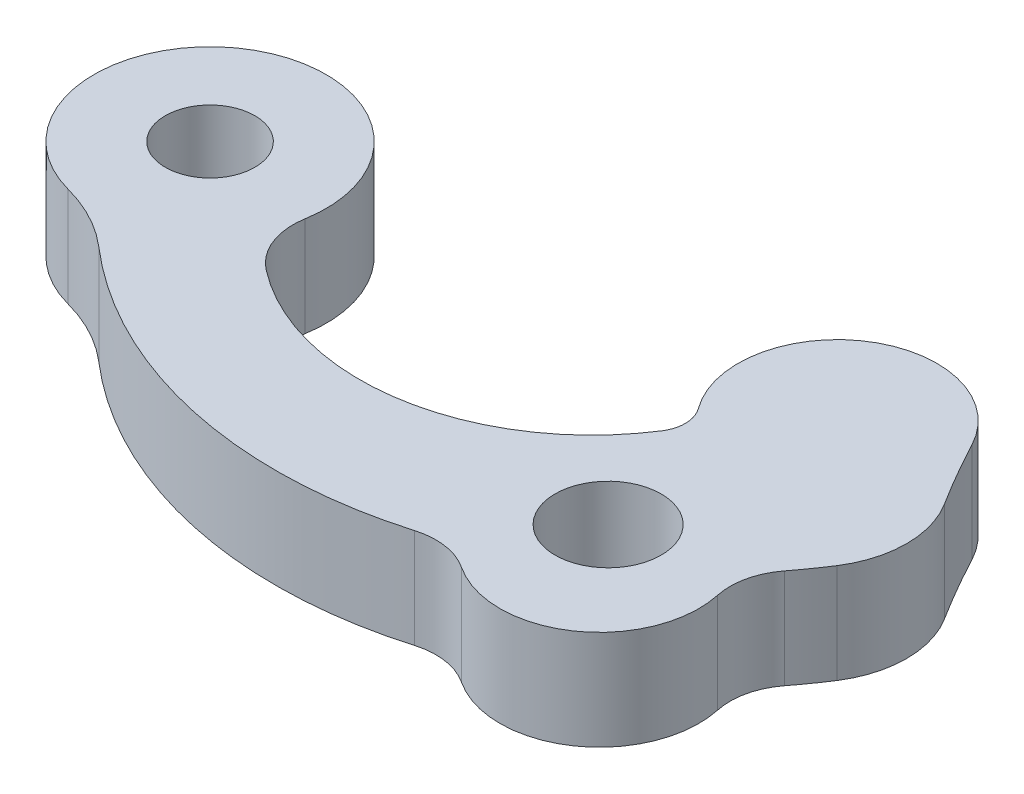
ISO-10303-21;
HEADER;
FILE_DESCRIPTION(('STEP AP214'),'2;1');
FILE_NAME('part.step','',(''),(''),'','','');
FILE_SCHEMA(('AUTOMOTIVE_DESIGN { 1 0 10303 214 1 1 1 1 }'));
ENDSEC;
DATA;
#1=APPLICATION_CONTEXT('core data for automotive mechanical design processes');
#2=APPLICATION_PROTOCOL_DEFINITION('international standard','automotive_design',2000,#1);
#3=PRODUCT_CONTEXT('',#1,'mechanical');
#4=PRODUCT('Part','Part','',(#3));
#5=PRODUCT_RELATED_PRODUCT_CATEGORY('part','',(#4));
#6=PRODUCT_DEFINITION_FORMATION('','',#4);
#7=PRODUCT_DEFINITION_CONTEXT('part definition',#1,'design');
#8=PRODUCT_DEFINITION('design','',#6,#7);
#9=PRODUCT_DEFINITION_SHAPE('','',#8);
#10=(LENGTH_UNIT() NAMED_UNIT(*) SI_UNIT(.MILLI.,.METRE.));
#11=(NAMED_UNIT(*) PLANE_ANGLE_UNIT() SI_UNIT($,.RADIAN.));
#12=(NAMED_UNIT(*) SI_UNIT($,.STERADIAN.) SOLID_ANGLE_UNIT());
#13=UNCERTAINTY_MEASURE_WITH_UNIT(LENGTH_MEASURE(1.E-05),#10,'distance_accuracy_value','');
#14=(GEOMETRIC_REPRESENTATION_CONTEXT(3) GLOBAL_UNCERTAINTY_ASSIGNED_CONTEXT((#13)) GLOBAL_UNIT_ASSIGNED_CONTEXT((#10,
#11,#12)) REPRESENTATION_CONTEXT('',''));
#15=CARTESIAN_POINT('',(0.,0.,0.));
#16=DIRECTION('',(0.,0.,1.));
#17=DIRECTION('',(1.,0.,0.));
#18=AXIS2_PLACEMENT_3D('',#15,#16,#17);
#19=CARTESIAN_POINT('',(9.58333333333333,3.,-5.39997427977414));
#20=DIRECTION('',(0.,-1.,0.));
#21=DIRECTION('',(0.,0.,1.));
#22=AXIS2_PLACEMENT_3D('',#19,#20,#21);
#23=CYLINDRICAL_SURFACE('',#22,13.);
#24=CARTESIAN_POINT('',(9.58333333333333,0.,-5.39997427977414));
#25=DIRECTION('',(0.,-1.,0.));
#26=DIRECTION('',(0.,0.,-1.));
#27=AXIS2_PLACEMENT_3D('',#24,#25,#26);
#28=CIRCLE('',#27,13.);
#29=CARTESIAN_POINT('',(19.8692193431616,0.,2.54990301442477));
#30=VERTEX_POINT('',#29);
#31=CARTESIAN_POINT('',(20.525,0.,1.61999228393224));
#32=VERTEX_POINT('',#31);
#33=EDGE_CURVE('E155',#30,#32,#28,.F.);
#34=ORIENTED_EDGE('',*,*,#33,.T.);
#35=DIRECTION('',(0.,-1.,0.));
#36=VECTOR('',#35,1.);
#37=CARTESIAN_POINT('',(20.525,3.,1.61999228393224));
#38=LINE('',#37,#36);
#39=CARTESIAN_POINT('',(20.525,3.,1.61999228393224));
#40=VERTEX_POINT('',#39);
#41=EDGE_CURVE('E140',#40,#32,#38,.T.);
#42=ORIENTED_EDGE('',*,*,#41,.F.);
#43=CARTESIAN_POINT('',(9.58333333333333,3.,-5.39997427977414));
#44=DIRECTION('',(0.,-1.,0.));
#45=DIRECTION('',(0.,0.,-1.));
#46=AXIS2_PLACEMENT_3D('',#43,#44,#45);
#47=CIRCLE('',#46,13.);
#48=CARTESIAN_POINT('',(19.8692193431616,3.,2.54990301442477));
#49=VERTEX_POINT('',#48);
#50=EDGE_CURVE('E144',#49,#40,#47,.F.);
#51=ORIENTED_EDGE('',*,*,#50,.F.);
#52=DIRECTION('',(0.,-1.,0.));
#53=VECTOR('',#52,1.);
#54=CARTESIAN_POINT('',(19.8692193431616,3.,2.54990301442477));
#55=LINE('',#54,#53);
#56=EDGE_CURVE('E206',#30,#49,#55,.F.);
#57=ORIENTED_EDGE('',*,*,#56,.F.);
#58=EDGE_LOOP('',(#34,#42,#51,#57));
#59=FACE_BOUND('',#58,.T.);
#60=ADVANCED_FACE('F41',(#59),#23,.T.);
#61=CARTESIAN_POINT('',(8.47222222222222,3.,-3.03668414842308));
#62=DIRECTION('',(0.,-1.,0.));
#63=DIRECTION('',(0.,0.,1.));
#64=AXIS2_PLACEMENT_3D('',#61,#62,#63);
#65=CYLINDRICAL_SURFACE('',#64,7.);
#66=CARTESIAN_POINT('',(8.47222222222222,0.,-3.03668414842308));
#67=DIRECTION('',(0.,-1.,0.));
#68=DIRECTION('',(0.,0.,-1.));
#69=AXIS2_PLACEMENT_3D('',#66,#67,#68);
#70=CIRCLE('',#69,7.);
#71=CARTESIAN_POINT('',(4.20145579431538,0.,2.50953565593591));
#72=VERTEX_POINT('',#71);
#73=CARTESIAN_POINT('',(14.3662242350737,0.,0.73965538510701));
#74=VERTEX_POINT('',#73);
#75=EDGE_CURVE('E244',#72,#74,#70,.F.);
#76=ORIENTED_EDGE('',*,*,#75,.F.);
#77=DIRECTION('',(0.,-1.,0.));
#78=VECTOR('',#77,1.);
#79=CARTESIAN_POINT('',(4.20145579431538,3.,2.50953565593591));
#80=LINE('',#79,#78);
#81=CARTESIAN_POINT('',(4.20145579431538,3.,2.50953565593591));
#82=VERTEX_POINT('',#81);
#83=EDGE_CURVE('E168',#82,#72,#80,.T.);
#84=ORIENTED_EDGE('',*,*,#83,.F.);
#85=CARTESIAN_POINT('',(8.47222222222222,3.,-3.03668414842308));
#86=DIRECTION('',(0.,-1.,0.));
#87=DIRECTION('',(0.,0.,-1.));
#88=AXIS2_PLACEMENT_3D('',#85,#86,#87);
#89=CIRCLE('',#88,7.);
#90=CARTESIAN_POINT('',(14.3662242350737,3.,0.73965538510701));
#91=VERTEX_POINT('',#90);
#92=EDGE_CURVE('E234',#82,#91,#89,.F.);
#93=ORIENTED_EDGE('',*,*,#92,.T.);
#94=DIRECTION('',(0.,-1.,0.));
#95=VECTOR('',#94,1.);
#96=CARTESIAN_POINT('',(14.3662242350737,3.,0.739655385107009));
#97=LINE('',#96,#95);
#98=EDGE_CURVE('E171',#74,#91,#97,.F.);
#99=ORIENTED_EDGE('',*,*,#98,.F.);
#100=EDGE_LOOP('',(#76,#84,#93,#99));
#101=FACE_BOUND('',#100,.T.);
#102=ADVANCED_FACE('F277',(#101),#65,.F.);
#103=CARTESIAN_POINT('',(16.75,3.,-2.16506350946109));
#104=DIRECTION('',(0.,-1.,0.));
#105=DIRECTION('',(0.,0.,1.));
#106=AXIS2_PLACEMENT_3D('',#103,#104,#105);
#107=CYLINDRICAL_SURFACE('',#106,3.);
#108=CARTESIAN_POINT('',(16.75,0.,-2.16506350946109));
#109=DIRECTION('',(0.,-1.,0.));
#110=DIRECTION('',(0.,0.,-1.));
#111=AXIS2_PLACEMENT_3D('',#108,#109,#110);
#112=CIRCLE('',#111,3.);
#113=CARTESIAN_POINT('',(14.3306679606426,0.,-0.391132145698954));
#114=VERTEX_POINT('',#113);
#115=CARTESIAN_POINT('',(19.4030298609084,0.,-3.56557504355433));
#116=VERTEX_POINT('',#115);
#117=EDGE_CURVE('E247',#114,#116,#112,.T.);
#118=ORIENTED_EDGE('',*,*,#117,.F.);
#119=DIRECTION('',(0.,-1.,0.));
#120=VECTOR('',#119,1.);
#121=CARTESIAN_POINT('',(14.3306679606426,3.,-0.391132145698954));
#122=LINE('',#121,#120);
#123=CARTESIAN_POINT('',(14.3306679606426,3.,-0.391132145698954));
#124=VERTEX_POINT('',#123);
#125=EDGE_CURVE('E157',#124,#114,#122,.T.);
#126=ORIENTED_EDGE('',*,*,#125,.F.);
#127=CARTESIAN_POINT('',(16.75,3.,-2.16506350946109));
#128=DIRECTION('',(0.,-1.,0.));
#129=DIRECTION('',(0.,0.,-1.));
#130=AXIS2_PLACEMENT_3D('',#127,#128,#129);
#131=CIRCLE('',#130,3.);
#132=CARTESIAN_POINT('',(19.4030298609084,3.,-3.56557504355433));
#133=VERTEX_POINT('',#132);
#134=EDGE_CURVE('E145',#124,#133,#131,.T.);
#135=ORIENTED_EDGE('',*,*,#134,.T.);
#136=DIRECTION('',(0.,-1.,0.));
#137=VECTOR('',#136,1.);
#138=CARTESIAN_POINT('',(19.4030298609084,3.,-3.56557504355433));
#139=LINE('',#138,#137);
#140=EDGE_CURVE('E165',#116,#133,#139,.F.);
#141=ORIENTED_EDGE('',*,*,#140,.F.);
#142=EDGE_LOOP('',(#118,#126,#135,#141));
#143=FACE_BOUND('',#142,.T.);
#144=ADVANCED_FACE('F282',(#143),#107,.T.);
#145=CARTESIAN_POINT('',(18.,3.,0.));
#146=DIRECTION('',(0.,-1.,0.));
#147=DIRECTION('',(0.,0.,1.));
#148=AXIS2_PLACEMENT_3D('',#145,#146,#147);
#149=CYLINDRICAL_SURFACE('',#148,3.);
#150=CARTESIAN_POINT('',(18.,3.,0.));
#151=DIRECTION('',(0.,-1.,0.));
#152=DIRECTION('',(0.,0.,-1.));
#153=AXIS2_PLACEMENT_3D('',#150,#151,#152);
#154=CIRCLE('',#153,3.);
#155=CARTESIAN_POINT('',(20.5393934972721,3.,-1.59733548949879));
#156=VERTEX_POINT('',#155);
#157=EDGE_CURVE('E136',#156,#40,#154,.T.);
#158=ORIENTED_EDGE('',*,*,#157,.T.);
#159=ORIENTED_EDGE('',*,*,#41,.T.);
#160=CARTESIAN_POINT('',(18.,0.,0.));
#161=DIRECTION('',(0.,-1.,0.));
#162=DIRECTION('',(0.,0.,-1.));
#163=AXIS2_PLACEMENT_3D('',#160,#161,#162);
#164=CIRCLE('',#163,3.);
#165=CARTESIAN_POINT('',(20.5393934972721,0.,-1.59733548949879));
#166=VERTEX_POINT('',#165);
#167=EDGE_CURVE('E249',#166,#32,#164,.T.);
#168=ORIENTED_EDGE('',*,*,#167,.F.);
#169=DIRECTION('',(0.,-1.,0.));
#170=VECTOR('',#169,1.);
#171=CARTESIAN_POINT('',(20.5393934972721,3.,-1.59733548949879));
#172=LINE('',#171,#170);
#173=EDGE_CURVE('E143',#156,#166,#172,.T.);
#174=ORIENTED_EDGE('',*,*,#173,.F.);
#175=EDGE_LOOP('',(#158,#159,#168,#174));
#176=FACE_BOUND('',#175,.T.);
#177=ADVANCED_FACE('F137',(#176),#149,.T.);
#178=CARTESIAN_POINT('',(0.,3.,0.));
#179=DIRECTION('',(0.,-1.,0.));
#180=DIRECTION('',(0.,0.,1.));
#181=AXIS2_PLACEMENT_3D('',#178,#179,#180);
#182=CYLINDRICAL_SURFACE('',#181,1.35);
#183=CARTESIAN_POINT('',(0.,3.,0.));
#184=DIRECTION('',(0.,-1.,0.));
#185=DIRECTION('',(0.,0.,-1.));
#186=AXIS2_PLACEMENT_3D('',#183,#184,#185);
#187=CIRCLE('',#186,1.35);
#188=CARTESIAN_POINT('',(0.,3.,-1.35));
#189=VERTEX_POINT('',#188);
#190=EDGE_CURVE('E231',#189,#189,#187,.T.);
#191=ORIENTED_EDGE('',*,*,#190,.F.);
#192=EDGE_LOOP('',(#191));
#193=FACE_BOUND('',#192,.T.);
#194=CARTESIAN_POINT('',(0.,0.,0.));
#195=DIRECTION('',(0.,-1.,0.));
#196=DIRECTION('',(0.,0.,-1.));
#197=AXIS2_PLACEMENT_3D('',#194,#195,#196);
#198=CIRCLE('',#197,1.35);
#199=CARTESIAN_POINT('',(0.,0.,-1.35));
#200=VERTEX_POINT('',#199);
#201=EDGE_CURVE('E241',#200,#200,#198,.T.);
#202=ORIENTED_EDGE('',*,*,#201,.T.);
#203=EDGE_LOOP('',(#202));
#204=FACE_BOUND('',#203,.T.);
#205=ADVANCED_FACE('F294',(#193,#204),#182,.F.);
#206=CARTESIAN_POINT('',(16.,3.,4.));
#207=DIRECTION('',(0.,-1.,0.));
#208=DIRECTION('',(0.,0.,1.));
#209=AXIS2_PLACEMENT_3D('',#206,#207,#208);
#210=CYLINDRICAL_SURFACE('',#209,1.6);
#211=CARTESIAN_POINT('',(16.,3.,4.));
#212=DIRECTION('',(0.,-1.,0.));
#213=DIRECTION('',(0.,0.,-1.));
#214=AXIS2_PLACEMENT_3D('',#211,#212,#213);
#215=CIRCLE('',#214,1.6);
#216=CARTESIAN_POINT('',(16.,3.,2.4));
#217=VERTEX_POINT('',#216);
#218=EDGE_CURVE('E228',#217,#217,#215,.T.);
#219=ORIENTED_EDGE('',*,*,#218,.F.);
#220=EDGE_LOOP('',(#219));
#221=FACE_BOUND('',#220,.T.);
#222=CARTESIAN_POINT('',(16.,0.,4.));
#223=DIRECTION('',(0.,-1.,0.));
#224=DIRECTION('',(0.,0.,-1.));
#225=AXIS2_PLACEMENT_3D('',#222,#223,#224);
#226=CIRCLE('',#225,1.6);
#227=CARTESIAN_POINT('',(16.,0.,2.4));
#228=VERTEX_POINT('',#227);
#229=EDGE_CURVE('E225',#228,#228,#226,.T.);
#230=ORIENTED_EDGE('',*,*,#229,.T.);
#231=EDGE_LOOP('',(#230));
#232=FACE_BOUND('',#231,.T.);
#233=ADVANCED_FACE('F288',(#221,#232),#210,.F.);
#234=CARTESIAN_POINT('',(1.07705841033847,3.,4.43075748009139));
#235=VERTEX_POINT('',#234);
#236=CARTESIAN_POINT('',(13.2400714875913,3.,7.07513157433364));
#237=VERTEX_POINT('',#236);
#238=EDGE_CURVE('E152',#235,#237,#47,.F.);
#239=ORIENTED_EDGE('',*,*,#238,.F.);
#240=DIRECTION('',(0.,-1.,0.));
#241=VECTOR('',#240,1.);
#242=CARTESIAN_POINT('',(1.07705841033847,3.,4.43075748009139));
#243=LINE('',#242,#241);
#244=CARTESIAN_POINT('',(1.07705841033847,0.,4.43075748009139));
#245=VERTEX_POINT('',#244);
#246=EDGE_CURVE('E178',#245,#235,#243,.F.);
#247=ORIENTED_EDGE('',*,*,#246,.F.);
#248=CARTESIAN_POINT('',(13.2400714875913,0.,7.07513157433364));
#249=VERTEX_POINT('',#248);
#250=EDGE_CURVE('E160',#245,#249,#28,.F.);
#251=ORIENTED_EDGE('',*,*,#250,.T.);
#252=DIRECTION('',(0.,-1.,0.));
#253=VECTOR('',#252,1.);
#254=CARTESIAN_POINT('',(13.2400714875913,3.,7.07513157433364));
#255=LINE('',#254,#253);
#256=EDGE_CURVE('E203',#237,#249,#255,.T.);
#257=ORIENTED_EDGE('',*,*,#256,.F.);
#258=EDGE_LOOP('',(#239,#247,#251,#257));
#259=FACE_BOUND('',#258,.T.);
#260=ADVANCED_FACE('F257',(#259),#23,.T.);
#261=CARTESIAN_POINT('',(0.,3.,0.));
#262=DIRECTION('',(0.,1.,0.));
#263=DIRECTION('',(0.,0.,-1.));
#264=AXIS2_PLACEMENT_3D('',#261,#262,#263);
#265=PLANE('',#264);
#266=ORIENTED_EDGE('',*,*,#238,.T.);
#267=CARTESIAN_POINT('',(13.8026465882464,3.,8.99437862881175));
#268=DIRECTION('',(0.,-1.,0.));
#269=DIRECTION('',(0.,0.,-1.));
#270=AXIS2_PLACEMENT_3D('',#267,#268,#269);
#271=CIRCLE('',#270,2.);
#272=CARTESIAN_POINT('',(14.9071048278201,3.,7.32699385107217));
#273=VERTEX_POINT('',#272);
#274=EDGE_CURVE('E208',#273,#237,#271,.F.);
#275=ORIENTED_EDGE('',*,*,#274,.F.);
#276=CARTESIAN_POINT('',(16.5637921871807,3.,4.82591668446279));
#277=DIRECTION('',(0.,-1.,0.));
#278=DIRECTION('',(0.,0.,-1.));
#279=AXIS2_PLACEMENT_3D('',#276,#277,#278);
#280=CIRCLE('',#279,3.);
#281=CARTESIAN_POINT('',(19.4965148816765,3.,4.1941433095968));
#282=VERTEX_POINT('',#281);
#283=EDGE_CURVE('E215',#282,#273,#280,.T.);
#284=ORIENTED_EDGE('',*,*,#283,.F.);
#285=CARTESIAN_POINT('',(21.4516633446736,3.,3.77296105968614));
#286=DIRECTION('',(0.,-1.,0.));
#287=DIRECTION('',(0.,0.,-1.));
#288=AXIS2_PLACEMENT_3D('',#285,#286,#287);
#289=CIRCLE('',#288,2.);
#290=EDGE_CURVE('E49',#49,#282,#289,.F.);
#291=ORIENTED_EDGE('',*,*,#290,.F.);
#292=ORIENTED_EDGE('',*,*,#50,.T.);
#293=ORIENTED_EDGE('',*,*,#157,.F.);
#294=CARTESIAN_POINT('',(45.9333284699927,3.,-17.5706903844867));
#295=DIRECTION('',(0.,-1.,0.));
#296=DIRECTION('',(0.,0.,-1.));
#297=AXIS2_PLACEMENT_3D('',#294,#295,#296);
#298=CIRCLE('',#297,30.);
#299=EDGE_CURVE('E183',#133,#156,#298,.F.);
#300=ORIENTED_EDGE('',*,*,#299,.F.);
#301=ORIENTED_EDGE('',*,*,#134,.F.);
#302=CARTESIAN_POINT('',(13.5242239475235,3.,0.200178308888426));
#303=DIRECTION('',(0.,-1.,0.));
#304=DIRECTION('',(0.,0.,-1.));
#305=AXIS2_PLACEMENT_3D('',#302,#303,#304);
#306=CIRCLE('',#305,1.);
#307=EDGE_CURVE('E187',#91,#124,#306,.F.);
#308=ORIENTED_EDGE('',*,*,#307,.F.);
#309=ORIENTED_EDGE('',*,*,#92,.F.);
#310=CARTESIAN_POINT('',(5.42167477371734,3.,0.924901426119055));
#311=DIRECTION('',(0.,-1.,0.));
#312=DIRECTION('',(0.,0.,-1.));
#313=AXIS2_PLACEMENT_3D('',#310,#311,#312);
#314=CIRCLE('',#313,2.);
#315=CARTESIAN_POINT('',(3.45015667418376,3.,0.588573634803035));
#316=VERTEX_POINT('',#315);
#317=EDGE_CURVE('E192',#316,#82,#314,.F.);
#318=ORIENTED_EDGE('',*,*,#317,.F.);
#319=CARTESIAN_POINT('',(0.,3.,0.));
#320=DIRECTION('',(0.,-1.,0.));
#321=DIRECTION('',(0.,0.,-1.));
#322=AXIS2_PLACEMENT_3D('',#319,#320,#321);
#323=CIRCLE('',#322,3.5);
#324=CARTESIAN_POINT('',(-0.90365297268787,3.,3.38133277051407));
#325=VERTEX_POINT('',#324);
#326=EDGE_CURVE('E219',#325,#316,#323,.T.);
#327=ORIENTED_EDGE('',*,*,#326,.F.);
#328=CARTESIAN_POINT('',(-2.1945857908134,3.,8.21180815696275));
#329=DIRECTION('',(0.,-1.,0.));
#330=DIRECTION('',(0.,0.,-1.));
#331=AXIS2_PLACEMENT_3D('',#328,#329,#330);
#332=CIRCLE('',#331,5.);
#333=EDGE_CURVE('E196',#235,#325,#332,.F.);
#334=ORIENTED_EDGE('',*,*,#333,.F.);
#335=EDGE_LOOP('',(#266,#275,#284,#291,#292,#293,#300,#301,#308,#309,#318,#327,#334));
#336=FACE_BOUND('',#335,.T.);
#337=ORIENTED_EDGE('',*,*,#218,.T.);
#338=EDGE_LOOP('',(#337));
#339=FACE_BOUND('',#338,.T.);
#340=ORIENTED_EDGE('',*,*,#190,.T.);
#341=EDGE_LOOP('',(#340));
#342=FACE_BOUND('',#341,.T.);
#343=ADVANCED_FACE('F149',(#336,#339,#342),#265,.T.);
#344=CARTESIAN_POINT('',(0.,0.,0.));
#345=DIRECTION('',(0.,1.,0.));
#346=DIRECTION('',(0.,0.,-1.));
#347=AXIS2_PLACEMENT_3D('',#344,#345,#346);
#348=PLANE('',#347);
#349=ORIENTED_EDGE('',*,*,#75,.T.);
#350=CARTESIAN_POINT('',(13.5242239475235,0.,0.200178308888426));
#351=DIRECTION('',(0.,-1.,0.));
#352=DIRECTION('',(0.,0.,-1.));
#353=AXIS2_PLACEMENT_3D('',#350,#351,#352);
#354=CIRCLE('',#353,1.);
#355=EDGE_CURVE('E185',#114,#74,#354,.T.);
#356=ORIENTED_EDGE('',*,*,#355,.F.);
#357=ORIENTED_EDGE('',*,*,#117,.T.);
#358=CARTESIAN_POINT('',(45.9333284699927,0.,-17.5706903844867));
#359=DIRECTION('',(0.,-1.,0.));
#360=DIRECTION('',(0.,0.,-1.));
#361=AXIS2_PLACEMENT_3D('',#358,#359,#360);
#362=CIRCLE('',#361,30.);
#363=EDGE_CURVE('E181',#166,#116,#362,.T.);
#364=ORIENTED_EDGE('',*,*,#363,.F.);
#365=ORIENTED_EDGE('',*,*,#167,.T.);
#366=ORIENTED_EDGE('',*,*,#33,.F.);
#367=CARTESIAN_POINT('',(21.4516633446736,0.,3.77296105968614));
#368=DIRECTION('',(0.,-1.,0.));
#369=DIRECTION('',(0.,0.,-1.));
#370=AXIS2_PLACEMENT_3D('',#367,#368,#369);
#371=CIRCLE('',#370,2.);
#372=CARTESIAN_POINT('',(19.4965148816765,0.,4.1941433095968));
#373=VERTEX_POINT('',#372);
#374=EDGE_CURVE('E12',#373,#30,#371,.T.);
#375=ORIENTED_EDGE('',*,*,#374,.F.);
#376=CARTESIAN_POINT('',(16.5637921871807,0.,4.82591668446279));
#377=DIRECTION('',(0.,-1.,0.));
#378=DIRECTION('',(0.,0.,-1.));
#379=AXIS2_PLACEMENT_3D('',#376,#377,#378);
#380=CIRCLE('',#379,3.);
#381=CARTESIAN_POINT('',(14.9071048278201,0.,7.32699385107217));
#382=VERTEX_POINT('',#381);
#383=EDGE_CURVE('E217',#382,#373,#380,.F.);
#384=ORIENTED_EDGE('',*,*,#383,.F.);
#385=CARTESIAN_POINT('',(13.8026465882464,0.,8.99437862881175));
#386=DIRECTION('',(0.,-1.,0.));
#387=DIRECTION('',(0.,0.,-1.));
#388=AXIS2_PLACEMENT_3D('',#385,#386,#387);
#389=CIRCLE('',#388,2.);
#390=EDGE_CURVE('E210',#249,#382,#389,.T.);
#391=ORIENTED_EDGE('',*,*,#390,.F.);
#392=ORIENTED_EDGE('',*,*,#250,.F.);
#393=CARTESIAN_POINT('',(-2.1945857908134,0.,8.21180815696275));
#394=DIRECTION('',(0.,-1.,0.));
#395=DIRECTION('',(0.,0.,-1.));
#396=AXIS2_PLACEMENT_3D('',#393,#394,#395);
#397=CIRCLE('',#396,5.);
#398=CARTESIAN_POINT('',(-0.90365297268787,0.,3.38133277051407));
#399=VERTEX_POINT('',#398);
#400=EDGE_CURVE('E194',#399,#245,#397,.T.);
#401=ORIENTED_EDGE('',*,*,#400,.F.);
#402=CARTESIAN_POINT('',(0.,0.,0.));
#403=DIRECTION('',(0.,-1.,0.));
#404=DIRECTION('',(0.,0.,-1.));
#405=AXIS2_PLACEMENT_3D('',#402,#403,#404);
#406=CIRCLE('',#405,3.5);
#407=CARTESIAN_POINT('',(3.45015667418376,0.,0.588573634803035));
#408=VERTEX_POINT('',#407);
#409=EDGE_CURVE('E222',#399,#408,#406,.T.);
#410=ORIENTED_EDGE('',*,*,#409,.T.);
#411=CARTESIAN_POINT('',(5.42167477371734,0.,0.924901426119055));
#412=DIRECTION('',(0.,-1.,0.));
#413=DIRECTION('',(0.,0.,-1.));
#414=AXIS2_PLACEMENT_3D('',#411,#412,#413);
#415=CIRCLE('',#414,2.);
#416=EDGE_CURVE('E189',#72,#408,#415,.T.);
#417=ORIENTED_EDGE('',*,*,#416,.F.);
#418=EDGE_LOOP('',(#349,#356,#357,#364,#365,#366,#375,#384,#391,#392,#401,#410,#417));
#419=FACE_BOUND('',#418,.T.);
#420=ORIENTED_EDGE('',*,*,#229,.F.);
#421=EDGE_LOOP('',(#420));
#422=FACE_BOUND('',#421,.T.);
#423=ORIENTED_EDGE('',*,*,#201,.F.);
#424=EDGE_LOOP('',(#423));
#425=FACE_BOUND('',#424,.T.);
#426=ADVANCED_FACE('F259',(#419,#422,#425),#348,.F.);
#427=CARTESIAN_POINT('',(0.,0.,0.));
#428=DIRECTION('',(0.,1.,0.));
#429=DIRECTION('',(0.,0.,-1.));
#430=AXIS2_PLACEMENT_3D('',#427,#428,#429);
#431=CYLINDRICAL_SURFACE('',#430,3.5);
#432=ORIENTED_EDGE('',*,*,#409,.F.);
#433=DIRECTION('',(0.,1.,0.));
#434=VECTOR('',#433,1.);
#435=CARTESIAN_POINT('',(-0.90365297268787,0.,3.38133277051407));
#436=LINE('',#435,#434);
#437=EDGE_CURVE('E174',#325,#399,#436,.F.);
#438=ORIENTED_EDGE('',*,*,#437,.F.);
#439=ORIENTED_EDGE('',*,*,#326,.T.);
#440=DIRECTION('',(0.,1.,0.));
#441=VECTOR('',#440,1.);
#442=CARTESIAN_POINT('',(3.45015667418376,0.,0.588573634803035));
#443=LINE('',#442,#441);
#444=EDGE_CURVE('E176',#408,#316,#443,.T.);
#445=ORIENTED_EDGE('',*,*,#444,.F.);
#446=EDGE_LOOP('',(#432,#438,#439,#445));
#447=FACE_BOUND('',#446,.T.);
#448=ADVANCED_FACE('F309',(#447),#431,.T.);
#449=CARTESIAN_POINT('',(45.9333284699927,3.,-17.5706903844867));
#450=DIRECTION('',(0.,1.,0.));
#451=DIRECTION('',(0.,0.,-1.));
#452=AXIS2_PLACEMENT_3D('',#449,#450,#451);
#453=CYLINDRICAL_SURFACE('',#452,30.);
#454=ORIENTED_EDGE('',*,*,#299,.T.);
#455=ORIENTED_EDGE('',*,*,#173,.T.);
#456=ORIENTED_EDGE('',*,*,#363,.T.);
#457=ORIENTED_EDGE('',*,*,#140,.T.);
#458=EDGE_LOOP('',(#454,#455,#456,#457));
#459=FACE_BOUND('',#458,.T.);
#460=ADVANCED_FACE('F305',(#459),#453,.F.);
#461=CARTESIAN_POINT('',(13.5242239475235,3.,0.200178308888426));
#462=DIRECTION('',(0.,-1.,0.));
#463=DIRECTION('',(0.,0.,1.));
#464=AXIS2_PLACEMENT_3D('',#461,#462,#463);
#465=CYLINDRICAL_SURFACE('',#464,1.);
#466=ORIENTED_EDGE('',*,*,#307,.T.);
#467=ORIENTED_EDGE('',*,*,#125,.T.);
#468=ORIENTED_EDGE('',*,*,#355,.T.);
#469=ORIENTED_EDGE('',*,*,#98,.T.);
#470=EDGE_LOOP('',(#466,#467,#468,#469));
#471=FACE_BOUND('',#470,.T.);
#472=ADVANCED_FACE('F308',(#471),#465,.F.);
#473=CARTESIAN_POINT('',(5.42167477371734,0.,0.924901426119055));
#474=DIRECTION('',(0.,-1.,0.));
#475=DIRECTION('',(0.,0.,1.));
#476=AXIS2_PLACEMENT_3D('',#473,#474,#475);
#477=CYLINDRICAL_SURFACE('',#476,2.);
#478=ORIENTED_EDGE('',*,*,#317,.T.);
#479=ORIENTED_EDGE('',*,*,#83,.T.);
#480=ORIENTED_EDGE('',*,*,#416,.T.);
#481=ORIENTED_EDGE('',*,*,#444,.T.);
#482=EDGE_LOOP('',(#478,#479,#480,#481));
#483=FACE_BOUND('',#482,.T.);
#484=ADVANCED_FACE('F272',(#483),#477,.F.);
#485=CARTESIAN_POINT('',(-2.1945857908134,3.,8.21180815696275));
#486=DIRECTION('',(0.,1.,0.));
#487=DIRECTION('',(0.,0.,-1.));
#488=AXIS2_PLACEMENT_3D('',#485,#486,#487);
#489=CYLINDRICAL_SURFACE('',#488,5.);
#490=ORIENTED_EDGE('',*,*,#333,.T.);
#491=ORIENTED_EDGE('',*,*,#437,.T.);
#492=ORIENTED_EDGE('',*,*,#400,.T.);
#493=ORIENTED_EDGE('',*,*,#246,.T.);
#494=EDGE_LOOP('',(#490,#491,#492,#493));
#495=FACE_BOUND('',#494,.T.);
#496=ADVANCED_FACE('F266',(#495),#489,.F.);
#497=CARTESIAN_POINT('',(16.5637921871807,-6.93890842292127,4.82591668446279));
#498=DIRECTION('',(0.,1.,0.));
#499=DIRECTION('',(0.,0.,-1.));
#500=AXIS2_PLACEMENT_3D('',#497,#498,#499);
#501=CYLINDRICAL_SURFACE('',#500,3.);
#502=ORIENTED_EDGE('',*,*,#383,.T.);
#503=DIRECTION('',(0.,1.,0.));
#504=VECTOR('',#503,1.);
#505=CARTESIAN_POINT('',(19.4965148816765,-6.93890842292127,4.1941433095968));
#506=LINE('',#505,#504);
#507=EDGE_CURVE('E199',#282,#373,#506,.F.);
#508=ORIENTED_EDGE('',*,*,#507,.F.);
#509=ORIENTED_EDGE('',*,*,#283,.T.);
#510=DIRECTION('',(0.,1.,0.));
#511=VECTOR('',#510,1.);
#512=CARTESIAN_POINT('',(14.9071048278201,-6.93890842292127,7.32699385107217));
#513=LINE('',#512,#511);
#514=EDGE_CURVE('E201',#382,#273,#513,.T.);
#515=ORIENTED_EDGE('',*,*,#514,.F.);
#516=EDGE_LOOP('',(#502,#508,#509,#515));
#517=FACE_BOUND('',#516,.T.);
#518=ADVANCED_FACE('F264',(#517),#501,.T.);
#519=CARTESIAN_POINT('',(13.8026465882464,3.,8.99437862881175));
#520=DIRECTION('',(0.,-1.,0.));
#521=DIRECTION('',(0.,0.,1.));
#522=AXIS2_PLACEMENT_3D('',#519,#520,#521);
#523=CYLINDRICAL_SURFACE('',#522,2.);
#524=ORIENTED_EDGE('',*,*,#390,.T.);
#525=ORIENTED_EDGE('',*,*,#514,.T.);
#526=ORIENTED_EDGE('',*,*,#274,.T.);
#527=ORIENTED_EDGE('',*,*,#256,.T.);
#528=EDGE_LOOP('',(#524,#525,#526,#527));
#529=FACE_BOUND('',#528,.T.);
#530=ADVANCED_FACE('F263',(#529),#523,.F.);
#531=CARTESIAN_POINT('',(21.4516633446736,-6.93890842292127,3.77296105968614));
#532=DIRECTION('',(0.,-1.,0.));
#533=DIRECTION('',(0.,0.,1.));
#534=AXIS2_PLACEMENT_3D('',#531,#532,#533);
#535=CYLINDRICAL_SURFACE('',#534,2.);
#536=ORIENTED_EDGE('',*,*,#374,.T.);
#537=ORIENTED_EDGE('',*,*,#56,.T.);
#538=ORIENTED_EDGE('',*,*,#290,.T.);
#539=ORIENTED_EDGE('',*,*,#507,.T.);
#540=EDGE_LOOP('',(#536,#537,#538,#539));
#541=FACE_BOUND('',#540,.T.);
#542=ADVANCED_FACE('F43',(#541),#535,.F.);
#543=CLOSED_SHELL('',(#60,#102,#144,#177,#205,#233,#260,#343,#426,#448,#460,#472,#484,#496,#518,
#530,#542));
#544=MANIFOLD_SOLID_BREP('B2',#543);
#545=ADVANCED_BREP_SHAPE_REPRESENTATION('',(#18,#544),#14);
#546=SHAPE_DEFINITION_REPRESENTATION(#9,#545);
ENDSEC;
END-ISO-10303-21;
